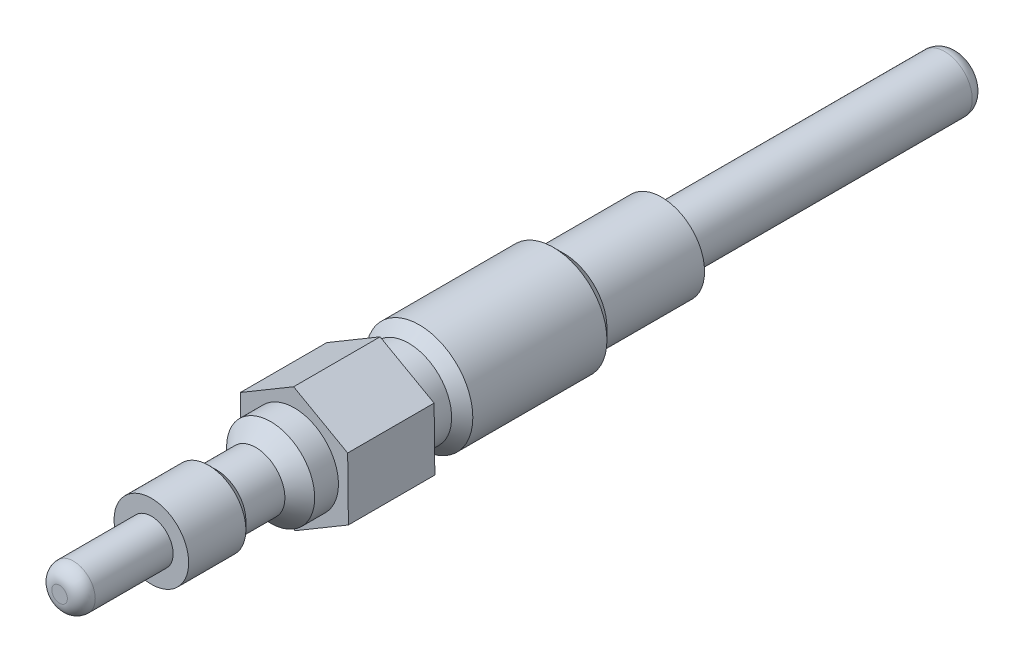
ISO-10303-21;
HEADER;
FILE_DESCRIPTION(('STEP AP214'),'2;1');
FILE_NAME('part.step','',(''),(''),'','','');
FILE_SCHEMA(('AUTOMOTIVE_DESIGN { 1 0 10303 214 1 1 1 1 }'));
ENDSEC;
DATA;
#1=APPLICATION_CONTEXT('core data for automotive mechanical design processes');
#2=APPLICATION_PROTOCOL_DEFINITION('international standard','automotive_design',2000,#1);
#3=PRODUCT_CONTEXT('',#1,'mechanical');
#4=PRODUCT('Part','Part','',(#3));
#5=PRODUCT_RELATED_PRODUCT_CATEGORY('part','',(#4));
#6=PRODUCT_DEFINITION_FORMATION('','',#4);
#7=PRODUCT_DEFINITION_CONTEXT('part definition',#1,'design');
#8=PRODUCT_DEFINITION('design','',#6,#7);
#9=PRODUCT_DEFINITION_SHAPE('','',#8);
#10=(LENGTH_UNIT() NAMED_UNIT(*) SI_UNIT(.MILLI.,.METRE.));
#11=(NAMED_UNIT(*) PLANE_ANGLE_UNIT() SI_UNIT($,.RADIAN.));
#12=(NAMED_UNIT(*) SI_UNIT($,.STERADIAN.) SOLID_ANGLE_UNIT());
#13=UNCERTAINTY_MEASURE_WITH_UNIT(LENGTH_MEASURE(1.E-05),#10,'distance_accuracy_value','');
#14=(GEOMETRIC_REPRESENTATION_CONTEXT(3) GLOBAL_UNCERTAINTY_ASSIGNED_CONTEXT((#13)) GLOBAL_UNIT_ASSIGNED_CONTEXT((#10,
#11,#12)) REPRESENTATION_CONTEXT('',''));
#15=CARTESIAN_POINT('',(0.,0.,0.));
#16=DIRECTION('',(0.,0.,1.));
#17=DIRECTION('',(1.,0.,0.));
#18=AXIS2_PLACEMENT_3D('',#15,#16,#17);
#19=CARTESIAN_POINT('',(0.,0.,-52.6288));
#20=DIRECTION('',(0.,0.,1.));
#21=DIRECTION('',(1.,0.,0.));
#22=AXIS2_PLACEMENT_3D('',#19,#20,#21);
#23=CYLINDRICAL_SURFACE('',#22,4.8768);
#24=CARTESIAN_POINT('',(0.,0.,-15.7226));
#25=DIRECTION('',(0.,0.,1.));
#26=DIRECTION('',(1.,0.,0.));
#27=AXIS2_PLACEMENT_3D('',#24,#25,#26);
#28=CIRCLE('',#27,4.8768);
#29=CARTESIAN_POINT('',(4.8768,0.,-15.7226));
#30=VERTEX_POINT('',#29);
#31=EDGE_CURVE('E170',#30,#30,#28,.T.);
#32=ORIENTED_EDGE('',*,*,#31,.T.);
#33=EDGE_LOOP('',(#32));
#34=FACE_BOUND('',#33,.T.);
#35=CARTESIAN_POINT('',(0.,0.,-3.5052));
#36=DIRECTION('',(0.,0.,-1.));
#37=DIRECTION('',(-1.,0.,0.));
#38=AXIS2_PLACEMENT_3D('',#35,#36,#37);
#39=CIRCLE('',#38,4.8768);
#40=CARTESIAN_POINT('',(-4.8768,0.,-3.5052));
#41=VERTEX_POINT('',#40);
#42=EDGE_CURVE('E139',#41,#41,#39,.T.);
#43=ORIENTED_EDGE('',*,*,#42,.T.);
#44=EDGE_LOOP('',(#43));
#45=FACE_BOUND('',#44,.T.);
#46=ADVANCED_FACE('F43',(#34,#45),#23,.T.);
#47=CARTESIAN_POINT('',(4.9230129308078,-2.76409551507037,7.874));
#48=DIRECTION('',(-0.999928042821284,-0.0119962152196831,0.));
#49=DIRECTION('',(0.0119962152196831,-0.999928042821284,0.));
#50=AXIS2_PLACEMENT_3D('',#47,#48,#49);
#51=PLANE('',#50);
#52=DIRECTION('',(-0.0119962152196831,0.999928042821284,0.));
#53=VECTOR('',#52,1.);
#54=CARTESIAN_POINT('',(4.9230129308078,-2.76409551507037,0.));
#55=LINE('',#54,#53);
#56=CARTESIAN_POINT('',(4.9230129308078,-2.76409551507037,0.));
#57=VERTEX_POINT('',#56);
#58=CARTESIAN_POINT('',(4.85528339994147,2.88140650370365,0.));
#59=VERTEX_POINT('',#58);
#60=EDGE_CURVE('E134',#57,#59,#55,.T.);
#61=ORIENTED_EDGE('',*,*,#60,.T.);
#62=DIRECTION('',(0.,0.,-1.));
#63=VECTOR('',#62,1.);
#64=CARTESIAN_POINT('',(4.85528339994147,2.88140650370365,7.874));
#65=LINE('',#64,#63);
#66=CARTESIAN_POINT('',(4.85528339994147,2.88140650370365,7.874));
#67=VERTEX_POINT('',#66);
#68=EDGE_CURVE('E162',#67,#59,#65,.T.);
#69=ORIENTED_EDGE('',*,*,#68,.F.);
#70=DIRECTION('',(-0.0119962152196831,0.999928042821284,0.));
#71=VECTOR('',#70,1.);
#72=CARTESIAN_POINT('',(4.9230129308078,-2.76409551507037,7.874));
#73=LINE('',#72,#71);
#74=CARTESIAN_POINT('',(4.9230129308078,-2.76409551507037,7.874));
#75=VERTEX_POINT('',#74);
#76=EDGE_CURVE('E151',#75,#67,#73,.T.);
#77=ORIENTED_EDGE('',*,*,#76,.F.);
#78=DIRECTION('',(0.,0.,-1.));
#79=VECTOR('',#78,1.);
#80=CARTESIAN_POINT('',(4.9230129308078,-2.76409551507037,7.874));
#81=LINE('',#80,#79);
#82=EDGE_CURVE('E130',#75,#57,#81,.T.);
#83=ORIENTED_EDGE('',*,*,#82,.T.);
#84=EDGE_LOOP('',(#61,#69,#77,#83));
#85=FACE_BOUND('',#84,.T.);
#86=ADVANCED_FACE('F200',(#85),#51,.F.);
#87=CARTESIAN_POINT('',(4.85528339994147,2.88140650370365,7.874));
#88=DIRECTION('',(-0.489574994281131,-0.871961194649527,0.));
#89=DIRECTION('',(0.871961194649527,-0.489574994281131,0.));
#90=AXIS2_PLACEMENT_3D('',#87,#88,#89);
#91=PLANE('',#90);
#92=DIRECTION('',(-0.871961194649527,0.489574994281131,0.));
#93=VECTOR('',#92,1.);
#94=CARTESIAN_POINT('',(4.85528339994147,2.88140650370365,0.));
#95=LINE('',#94,#93);
#96=CARTESIAN_POINT('',(-0.0677295308663265,5.64550201877403,0.));
#97=VERTEX_POINT('',#96);
#98=EDGE_CURVE('E138',#59,#97,#95,.T.);
#99=ORIENTED_EDGE('',*,*,#98,.T.);
#100=DIRECTION('',(0.,0.,-1.));
#101=VECTOR('',#100,1.);
#102=CARTESIAN_POINT('',(-0.0677295308663265,5.64550201877403,7.874));
#103=LINE('',#102,#101);
#104=CARTESIAN_POINT('',(-0.0677295308663265,5.64550201877403,7.874));
#105=VERTEX_POINT('',#104);
#106=EDGE_CURVE('E158',#105,#97,#103,.T.);
#107=ORIENTED_EDGE('',*,*,#106,.F.);
#108=DIRECTION('',(-0.871961194649527,0.489574994281131,0.));
#109=VECTOR('',#108,1.);
#110=CARTESIAN_POINT('',(4.85528339994147,2.88140650370365,7.874));
#111=LINE('',#110,#109);
#112=EDGE_CURVE('E99',#67,#105,#111,.T.);
#113=ORIENTED_EDGE('',*,*,#112,.F.);
#114=ORIENTED_EDGE('',*,*,#68,.T.);
#115=EDGE_LOOP('',(#99,#107,#113,#114));
#116=FACE_BOUND('',#115,.T.);
#117=ADVANCED_FACE('F206',(#116),#91,.F.);
#118=CARTESIAN_POINT('',(-0.0677295308663265,5.64550201877403,7.874));
#119=DIRECTION('',(0.510353048540153,-0.859964979429844,0.));
#120=DIRECTION('',(0.859964979429844,0.510353048540153,0.));
#121=AXIS2_PLACEMENT_3D('',#118,#119,#120);
#122=PLANE('',#121);
#123=DIRECTION('',(-0.859964979429844,-0.510353048540153,0.));
#124=VECTOR('',#123,1.);
#125=CARTESIAN_POINT('',(-0.0677295308663265,5.64550201877403,0.));
#126=LINE('',#125,#124);
#127=CARTESIAN_POINT('',(-4.92301293080781,2.76409551507037,0.));
#128=VERTEX_POINT('',#127);
#129=EDGE_CURVE('E142',#97,#128,#126,.T.);
#130=ORIENTED_EDGE('',*,*,#129,.T.);
#131=DIRECTION('',(0.,0.,-1.));
#132=VECTOR('',#131,1.);
#133=CARTESIAN_POINT('',(-4.92301293080781,2.76409551507037,7.874));
#134=LINE('',#133,#132);
#135=CARTESIAN_POINT('',(-4.92301293080781,2.76409551507037,7.874));
#136=VERTEX_POINT('',#135);
#137=EDGE_CURVE('E123',#136,#128,#134,.T.);
#138=ORIENTED_EDGE('',*,*,#137,.F.);
#139=DIRECTION('',(-0.859964979429844,-0.510353048540153,0.));
#140=VECTOR('',#139,1.);
#141=CARTESIAN_POINT('',(-0.0677295308663265,5.64550201877403,7.874));
#142=LINE('',#141,#140);
#143=EDGE_CURVE('E112',#105,#136,#142,.T.);
#144=ORIENTED_EDGE('',*,*,#143,.F.);
#145=ORIENTED_EDGE('',*,*,#106,.T.);
#146=EDGE_LOOP('',(#130,#138,#144,#145));
#147=FACE_BOUND('',#146,.T.);
#148=ADVANCED_FACE('F233',(#147),#122,.F.);
#149=CARTESIAN_POINT('',(-4.92301293080781,2.76409551507037,7.874));
#150=DIRECTION('',(0.999928042821284,0.0119962152196825,0.));
#151=DIRECTION('',(-0.0119962152196825,0.999928042821284,0.));
#152=AXIS2_PLACEMENT_3D('',#149,#150,#151);
#153=PLANE('',#152);
#154=DIRECTION('',(0.0119962152196825,-0.999928042821284,0.));
#155=VECTOR('',#154,1.);
#156=CARTESIAN_POINT('',(-4.92301293080781,2.76409551507037,0.));
#157=LINE('',#156,#155);
#158=CARTESIAN_POINT('',(-4.85528339994149,-2.88140650370365,0.));
#159=VERTEX_POINT('',#158);
#160=EDGE_CURVE('E121',#128,#159,#157,.T.);
#161=ORIENTED_EDGE('',*,*,#160,.T.);
#162=DIRECTION('',(0.,0.,-1.));
#163=VECTOR('',#162,1.);
#164=CARTESIAN_POINT('',(-4.85528339994149,-2.88140650370365,7.874));
#165=LINE('',#164,#163);
#166=CARTESIAN_POINT('',(-4.85528339994149,-2.88140650370365,7.874));
#167=VERTEX_POINT('',#166);
#168=EDGE_CURVE('E118',#167,#159,#165,.T.);
#169=ORIENTED_EDGE('',*,*,#168,.F.);
#170=DIRECTION('',(0.0119962152196825,-0.999928042821284,0.));
#171=VECTOR('',#170,1.);
#172=CARTESIAN_POINT('',(-4.92301293080781,2.76409551507037,7.874));
#173=LINE('',#172,#171);
#174=EDGE_CURVE('E106',#136,#167,#173,.T.);
#175=ORIENTED_EDGE('',*,*,#174,.F.);
#176=ORIENTED_EDGE('',*,*,#137,.T.);
#177=EDGE_LOOP('',(#161,#169,#175,#176));
#178=FACE_BOUND('',#177,.T.);
#179=ADVANCED_FACE('F119',(#178),#153,.F.);
#180=CARTESIAN_POINT('',(-4.85528339994149,-2.88140650370365,7.874));
#181=DIRECTION('',(0.489574994281132,0.871961194649527,0.));
#182=DIRECTION('',(-0.871961194649527,0.489574994281132,0.));
#183=AXIS2_PLACEMENT_3D('',#180,#181,#182);
#184=PLANE('',#183);
#185=DIRECTION('',(0.871961194649527,-0.489574994281132,0.));
#186=VECTOR('',#185,1.);
#187=CARTESIAN_POINT('',(-4.85528339994149,-2.88140650370365,0.));
#188=LINE('',#187,#186);
#189=CARTESIAN_POINT('',(0.0677295308663152,-5.64550201877403,0.));
#190=VERTEX_POINT('',#189);
#191=EDGE_CURVE('E84',#159,#190,#188,.T.);
#192=ORIENTED_EDGE('',*,*,#191,.T.);
#193=DIRECTION('',(0.,0.,-1.));
#194=VECTOR('',#193,1.);
#195=CARTESIAN_POINT('',(0.0677295308663152,-5.64550201877403,7.874));
#196=LINE('',#195,#194);
#197=CARTESIAN_POINT('',(0.0677295308663152,-5.64550201877403,7.874));
#198=VERTEX_POINT('',#197);
#199=EDGE_CURVE('E124',#198,#190,#196,.T.);
#200=ORIENTED_EDGE('',*,*,#199,.F.);
#201=DIRECTION('',(0.871961194649527,-0.489574994281132,0.));
#202=VECTOR('',#201,1.);
#203=CARTESIAN_POINT('',(-4.85528339994149,-2.88140650370365,7.874));
#204=LINE('',#203,#202);
#205=EDGE_CURVE('E110',#167,#198,#204,.T.);
#206=ORIENTED_EDGE('',*,*,#205,.F.);
#207=ORIENTED_EDGE('',*,*,#168,.T.);
#208=EDGE_LOOP('',(#192,#200,#206,#207));
#209=FACE_BOUND('',#208,.T.);
#210=ADVANCED_FACE('F126',(#209),#184,.F.);
#211=CARTESIAN_POINT('',(0.0677295308663152,-5.64550201877403,7.874));
#212=DIRECTION('',(-0.510353048540153,0.859964979429845,0.));
#213=DIRECTION('',(-0.859964979429844,-0.510353048540153,0.));
#214=AXIS2_PLACEMENT_3D('',#211,#212,#213);
#215=PLANE('',#214);
#216=DIRECTION('',(0.859964979429844,0.510353048540153,0.));
#217=VECTOR('',#216,1.);
#218=CARTESIAN_POINT('',(0.0677295308663152,-5.64550201877403,0.));
#219=LINE('',#218,#217);
#220=EDGE_CURVE('E90',#190,#57,#219,.T.);
#221=ORIENTED_EDGE('',*,*,#220,.T.);
#222=ORIENTED_EDGE('',*,*,#82,.F.);
#223=DIRECTION('',(0.859964979429844,0.510353048540153,0.));
#224=VECTOR('',#223,1.);
#225=CARTESIAN_POINT('',(0.0677295308663152,-5.64550201877403,7.874));
#226=LINE('',#225,#224);
#227=EDGE_CURVE('E61',#198,#75,#226,.T.);
#228=ORIENTED_EDGE('',*,*,#227,.F.);
#229=ORIENTED_EDGE('',*,*,#199,.T.);
#230=EDGE_LOOP('',(#221,#222,#228,#229));
#231=FACE_BOUND('',#230,.T.);
#232=ADVANCED_FACE('F222',(#231),#215,.F.);
#233=CARTESIAN_POINT('',(0.,0.,7.874));
#234=DIRECTION('',(0.,0.,1.));
#235=DIRECTION('',(1.,0.,0.));
#236=AXIS2_PLACEMENT_3D('',#233,#234,#235);
#237=PLANE('',#236);
#238=CARTESIAN_POINT('',(0.,0.,7.874));
#239=DIRECTION('',(0.,0.,1.));
#240=DIRECTION('',(1.,0.,0.));
#241=AXIS2_PLACEMENT_3D('',#238,#239,#240);
#242=CIRCLE('',#241,4.0132);
#243=CARTESIAN_POINT('',(-4.0132,0.,7.874));
#244=VERTEX_POINT('',#243);
#245=EDGE_CURVE('E165',#244,#244,#242,.T.);
#246=ORIENTED_EDGE('',*,*,#245,.F.);
#247=EDGE_LOOP('',(#246));
#248=FACE_BOUND('',#247,.T.);
#249=ORIENTED_EDGE('',*,*,#76,.T.);
#250=ORIENTED_EDGE('',*,*,#112,.T.);
#251=ORIENTED_EDGE('',*,*,#143,.T.);
#252=ORIENTED_EDGE('',*,*,#174,.T.);
#253=ORIENTED_EDGE('',*,*,#205,.T.);
#254=ORIENTED_EDGE('',*,*,#227,.T.);
#255=EDGE_LOOP('',(#249,#250,#251,#252,#253,#254));
#256=FACE_BOUND('',#255,.T.);
#257=ADVANCED_FACE('F108',(#248,#256),#237,.T.);
#258=CARTESIAN_POINT('',(0.,0.,0.));
#259=DIRECTION('',(0.,0.,1.));
#260=DIRECTION('',(1.,0.,0.));
#261=AXIS2_PLACEMENT_3D('',#258,#259,#260);
#262=PLANE('',#261);
#263=ORIENTED_EDGE('',*,*,#60,.F.);
#264=ORIENTED_EDGE('',*,*,#220,.F.);
#265=ORIENTED_EDGE('',*,*,#191,.F.);
#266=ORIENTED_EDGE('',*,*,#160,.F.);
#267=ORIENTED_EDGE('',*,*,#129,.F.);
#268=ORIENTED_EDGE('',*,*,#98,.F.);
#269=EDGE_LOOP('',(#263,#264,#265,#266,#267,#268));
#270=FACE_BOUND('',#269,.T.);
#271=CARTESIAN_POINT('',(0.,0.,0.));
#272=DIRECTION('',(0.,0.,-1.));
#273=DIRECTION('',(-1.,0.,0.));
#274=AXIS2_PLACEMENT_3D('',#271,#272,#273);
#275=CIRCLE('',#274,3.9116);
#276=CARTESIAN_POINT('',(-3.9116,0.,0.));
#277=VERTEX_POINT('',#276);
#278=EDGE_CURVE('E169',#277,#277,#275,.T.);
#279=ORIENTED_EDGE('',*,*,#278,.F.);
#280=EDGE_LOOP('',(#279));
#281=FACE_BOUND('',#280,.T.);
#282=ADVANCED_FACE('F218',(#270,#281),#262,.F.);
#283=CARTESIAN_POINT('',(0.,0.,29.2608));
#284=DIRECTION('',(0.,0.,-1.));
#285=DIRECTION('',(-1.,0.,0.));
#286=AXIS2_PLACEMENT_3D('',#283,#284,#285);
#287=CYLINDRICAL_SURFACE('',#286,4.0132);
#288=CARTESIAN_POINT('',(0.,0.,10.033));
#289=DIRECTION('',(0.,0.,-1.));
#290=DIRECTION('',(-1.,0.,0.));
#291=AXIS2_PLACEMENT_3D('',#288,#289,#290);
#292=CIRCLE('',#291,4.0132);
#293=CARTESIAN_POINT('',(-4.0132,0.,10.033));
#294=VERTEX_POINT('',#293);
#295=EDGE_CURVE('E265',#294,#294,#292,.T.);
#296=CARTESIAN_POINT('',(-4.0132,0.,10.033));
#297=CARTESIAN_POINT('',(-4.0132,0.,10.0105104166667));
#298=CARTESIAN_POINT('',(-4.0132,0.,9.98802083333334));
#299=CARTESIAN_POINT('',(-4.0132,0.,9.94304166666667));
#300=CARTESIAN_POINT('',(-4.0132,0.,9.92055208333334));
#301=CARTESIAN_POINT('',(-4.0132,0.,9.87557291666667));
#302=CARTESIAN_POINT('',(-4.0132,0.,9.85308333333334));
#303=CARTESIAN_POINT('',(-4.0132,0.,9.80810416666667));
#304=CARTESIAN_POINT('',(-4.0132,0.,9.78561458333333));
#305=CARTESIAN_POINT('',(-4.0132,0.,9.74063541666667));
#306=CARTESIAN_POINT('',(-4.0132,0.,9.71814583333334));
#307=CARTESIAN_POINT('',(-4.0132,0.,9.67316666666667));
#308=CARTESIAN_POINT('',(-4.0132,0.,9.65067708333334));
#309=CARTESIAN_POINT('',(-4.0132,0.,9.60569791666667));
#310=CARTESIAN_POINT('',(-4.0132,0.,9.58320833333334));
#311=CARTESIAN_POINT('',(-4.0132,0.,9.53822916666667));
#312=CARTESIAN_POINT('',(-4.0132,0.,9.51573958333334));
#313=CARTESIAN_POINT('',(-4.0132,0.,9.47076041666667));
#314=CARTESIAN_POINT('',(-4.0132,0.,9.44827083333333));
#315=CARTESIAN_POINT('',(-4.0132,0.,9.40329166666667));
#316=CARTESIAN_POINT('',(-4.0132,0.,9.38080208333333));
#317=CARTESIAN_POINT('',(-4.0132,0.,9.33582291666667));
#318=CARTESIAN_POINT('',(-4.0132,0.,9.31333333333333));
#319=CARTESIAN_POINT('',(-4.0132,0.,9.26835416666667));
#320=CARTESIAN_POINT('',(-4.0132,0.,9.24586458333333));
#321=CARTESIAN_POINT('',(-4.0132,0.,9.20088541666667));
#322=CARTESIAN_POINT('',(-4.0132,0.,9.17839583333333));
#323=CARTESIAN_POINT('',(-4.0132,0.,9.13341666666667));
#324=CARTESIAN_POINT('',(-4.0132,0.,9.11092708333334));
#325=CARTESIAN_POINT('',(-4.0132,0.,9.06594791666667));
#326=CARTESIAN_POINT('',(-4.0132,0.,9.04345833333333));
#327=CARTESIAN_POINT('',(-4.0132,0.,8.99847916666667));
#328=CARTESIAN_POINT('',(-4.0132,0.,8.97598958333333));
#329=CARTESIAN_POINT('',(-4.0132,0.,8.93101041666667));
#330=CARTESIAN_POINT('',(-4.0132,0.,8.90852083333333));
#331=CARTESIAN_POINT('',(-4.0132,0.,8.86354166666666));
#332=CARTESIAN_POINT('',(-4.0132,0.,8.84105208333333));
#333=CARTESIAN_POINT('',(-4.0132,0.,8.79607291666666));
#334=CARTESIAN_POINT('',(-4.0132,0.,8.77358333333333));
#335=CARTESIAN_POINT('',(-4.0132,0.,8.72860416666666));
#336=CARTESIAN_POINT('',(-4.0132,0.,8.70611458333333));
#337=CARTESIAN_POINT('',(-4.0132,0.,8.66113541666667));
#338=CARTESIAN_POINT('',(-4.0132,0.,8.63864583333333));
#339=CARTESIAN_POINT('',(-4.0132,0.,8.59366666666667));
#340=CARTESIAN_POINT('',(-4.0132,0.,8.57117708333333));
#341=CARTESIAN_POINT('',(-4.0132,0.,8.52619791666667));
#342=CARTESIAN_POINT('',(-4.0132,0.,8.50370833333333));
#343=CARTESIAN_POINT('',(-4.0132,0.,8.45872916666666));
#344=CARTESIAN_POINT('',(-4.0132,0.,8.43623958333333));
#345=CARTESIAN_POINT('',(-4.0132,0.,8.39126041666666));
#346=CARTESIAN_POINT('',(-4.0132,0.,8.36877083333333));
#347=CARTESIAN_POINT('',(-4.0132,0.,8.32379166666666));
#348=CARTESIAN_POINT('',(-4.0132,0.,8.30130208333333));
#349=CARTESIAN_POINT('',(-4.0132,0.,8.25632291666666));
#350=CARTESIAN_POINT('',(-4.0132,0.,8.23383333333333));
#351=CARTESIAN_POINT('',(-4.0132,0.,8.18885416666666));
#352=CARTESIAN_POINT('',(-4.0132,0.,8.16636458333333));
#353=CARTESIAN_POINT('',(-4.0132,0.,8.12138541666666));
#354=CARTESIAN_POINT('',(-4.0132,0.,8.09889583333333));
#355=CARTESIAN_POINT('',(-4.0132,0.,8.05391666666666));
#356=CARTESIAN_POINT('',(-4.0132,0.,8.03142708333333));
#357=CARTESIAN_POINT('',(-4.0132,0.,7.98644791666666));
#358=CARTESIAN_POINT('',(-4.0132,0.,7.96395833333333));
#359=CARTESIAN_POINT('',(-4.0132,0.,7.91897916666666));
#360=CARTESIAN_POINT('',(-4.0132,0.,7.89648958333333));
#361=CARTESIAN_POINT('',(-4.0132,0.,7.874));
#362=B_SPLINE_CURVE_WITH_KNOTS('',3,(#296,#297,#298,#299,#300,#301,#302,#303,#304,#305,#306,
#307,#308,#309,#310,#311,#312,#313,#314,#315,#316,#317,#318,#319,#320,#321,#322,#323,#324,#325,
#326,#327,#328,#329,#330,#331,#332,#333,#334,#335,#336,#337,#338,#339,#340,#341,#342,#343,#344,
#345,#346,#347,#348,#349,#350,#351,#352,#353,#354,#355,#356,#357,#358,#359,#360,#361),
.UNSPECIFIED.,.F.,.F.,(4,2,2,2,2,2,2,2,2,2,2,2,2,2,2,2,2,2,2,2,2,2,2,2,2,2,2,2,2,2,2,2,4),(0.,
0.0674687500000007,0.134937500000001,0.202406250000002,0.269875000000003,0.33734375,
0.404812500000001,0.472281250000001,0.539750000000002,0.607218750000003,0.674687500000003,
0.742156250000004,0.809625000000001,0.877093750000002,0.944562500000003,1.01203125,1.0795,
1.14696875,1.21443750000001,1.28190625000001,1.34937500000001,1.41684375,1.4843125,
1.55178125000001,1.61925000000001,1.68671875000001,1.75418750000001,1.82165625000001,
1.88912500000001,1.95659375000001,2.02406250000001,2.09153125000001,2.15900000000001),.UNSPECIFIED.);
#363=EDGE_CURVE('BSEAM214',#294,#244,#362,.T.);
#364=ORIENTED_EDGE('',*,*,#295,.T.);
#365=ORIENTED_EDGE('',*,*,#245,.T.);
#366=ORIENTED_EDGE('',*,*,#363,.T.);
#367=ORIENTED_EDGE('',*,*,#363,.F.);
#368=EDGE_LOOP('',(#364,#366,#365,#367));
#369=FACE_BOUND('',#368,.T.);
#370=ADVANCED_FACE('F214',(#369),#287,.T.);
#371=CARTESIAN_POINT('',(0.,0.,-2.54));
#372=DIRECTION('',(0.,0.,-1.));
#373=DIRECTION('',(-1.,0.,0.));
#374=AXIS2_PLACEMENT_3D('',#371,#372,#373);
#375=CONICAL_SURFACE('',#374,3.9116,0.785398163397451);
#376=CARTESIAN_POINT('',(0.,0.,-2.54));
#377=DIRECTION('',(0.,0.,-1.));
#378=DIRECTION('',(-1.,0.,0.));
#379=AXIS2_PLACEMENT_3D('',#376,#377,#378);
#380=CIRCLE('',#379,3.9116);
#381=CARTESIAN_POINT('',(-3.9116,0.,-2.54));
#382=VERTEX_POINT('',#381);
#383=EDGE_CURVE('E174',#382,#382,#380,.T.);
#384=ORIENTED_EDGE('',*,*,#383,.T.);
#385=EDGE_LOOP('',(#384));
#386=FACE_BOUND('',#385,.T.);
#387=ORIENTED_EDGE('',*,*,#42,.F.);
#388=EDGE_LOOP('',(#387));
#389=FACE_BOUND('',#388,.T.);
#390=ADVANCED_FACE('F217',(#386,#389),#375,.T.);
#391=CARTESIAN_POINT('',(0.,0.,-56.72328));
#392=DIRECTION('',(0.,0.,-1.));
#393=DIRECTION('',(-1.,0.,0.));
#394=AXIS2_PLACEMENT_3D('',#391,#392,#393);
#395=CYLINDRICAL_SURFACE('',#394,3.9116);
#396=ORIENTED_EDGE('',*,*,#383,.F.);
#397=EDGE_LOOP('',(#396));
#398=FACE_BOUND('',#397,.T.);
#399=ORIENTED_EDGE('',*,*,#278,.T.);
#400=EDGE_LOOP('',(#399));
#401=FACE_BOUND('',#400,.T.);
#402=ADVANCED_FACE('F299',(#398,#401),#395,.T.);
#403=CARTESIAN_POINT('',(0.,0.,-14.8707437554731));
#404=DIRECTION('',(0.,0.,1.));
#405=DIRECTION('',(1.,0.,0.));
#406=AXIS2_PLACEMENT_3D('',#403,#404,#405);
#407=CONICAL_SURFACE('',#406,5.72865624452693,0.785398163397451);
#408=CARTESIAN_POINT('',(0.,0.,-16.6878));
#409=DIRECTION('',(0.,0.,-1.));
#410=DIRECTION('',(-1.,0.,0.));
#411=AXIS2_PLACEMENT_3D('',#408,#409,#410);
#412=CIRCLE('',#411,3.9116);
#413=CARTESIAN_POINT('',(-3.9116,0.,-16.6878));
#414=VERTEX_POINT('',#413);
#415=EDGE_CURVE('E175',#414,#414,#412,.T.);
#416=ORIENTED_EDGE('',*,*,#415,.F.);
#417=EDGE_LOOP('',(#416));
#418=FACE_BOUND('',#417,.T.);
#419=ORIENTED_EDGE('',*,*,#31,.F.);
#420=EDGE_LOOP('',(#419));
#421=FACE_BOUND('',#420,.T.);
#422=ADVANCED_FACE('F301',(#418,#421),#407,.T.);
#423=CARTESIAN_POINT('',(0.,0.,-56.72328));
#424=DIRECTION('',(0.,0.,-1.));
#425=DIRECTION('',(-1.,0.,0.));
#426=AXIS2_PLACEMENT_3D('',#423,#424,#425);
#427=CYLINDRICAL_SURFACE('',#426,3.9116);
#428=CARTESIAN_POINT('',(0.,0.,-25.5778));
#429=DIRECTION('',(0.,0.,1.));
#430=DIRECTION('',(1.,0.,0.));
#431=AXIS2_PLACEMENT_3D('',#428,#429,#430);
#432=CIRCLE('',#431,3.9116);
#433=CARTESIAN_POINT('',(3.9116,0.,-25.5778));
#434=VERTEX_POINT('',#433);
#435=EDGE_CURVE('E264',#434,#434,#432,.T.);
#436=ORIENTED_EDGE('',*,*,#435,.T.);
#437=EDGE_LOOP('',(#436));
#438=FACE_BOUND('',#437,.T.);
#439=ORIENTED_EDGE('',*,*,#415,.T.);
#440=EDGE_LOOP('',(#439));
#441=FACE_BOUND('',#440,.T.);
#442=ADVANCED_FACE('F307',(#438,#441),#427,.T.);
#443=CARTESIAN_POINT('',(0.,2.5146,-25.5778));
#444=DIRECTION('',(0.,0.,1.));
#445=DIRECTION('',(1.,0.,0.));
#446=AXIS2_PLACEMENT_3D('',#443,#444,#445);
#447=PLANE('',#446);
#448=CARTESIAN_POINT('',(0.,0.,-25.5778));
#449=DIRECTION('',(0.,0.,-1.));
#450=DIRECTION('',(-1.,0.,0.));
#451=AXIS2_PLACEMENT_3D('',#448,#449,#450);
#452=CIRCLE('',#451,2.5146);
#453=CARTESIAN_POINT('',(-2.5146,0.,-25.5778));
#454=VERTEX_POINT('',#453);
#455=EDGE_CURVE('E261',#454,#454,#452,.T.);
#456=ORIENTED_EDGE('',*,*,#455,.F.);
#457=EDGE_LOOP('',(#456));
#458=FACE_BOUND('',#457,.T.);
#459=ORIENTED_EDGE('',*,*,#435,.F.);
#460=EDGE_LOOP('',(#459));
#461=FACE_BOUND('',#460,.T.);
#462=ADVANCED_FACE('F257',(#458,#461),#447,.F.);
#463=CARTESIAN_POINT('',(0.,0.,-56.72328));
#464=DIRECTION('',(0.,0.,-1.));
#465=DIRECTION('',(-1.,0.,0.));
#466=AXIS2_PLACEMENT_3D('',#463,#464,#465);
#467=CYLINDRICAL_SURFACE('',#466,2.5146);
#468=CARTESIAN_POINT('',(0.,0.,-51.3588));
#469=DIRECTION('',(0.,0.,-1.));
#470=DIRECTION('',(-1.,0.,0.));
#471=AXIS2_PLACEMENT_3D('',#468,#469,#470);
#472=CIRCLE('',#471,2.5146);
#473=CARTESIAN_POINT('',(-2.5146,0.,-51.3588));
#474=VERTEX_POINT('',#473);
#475=EDGE_CURVE('E176',#474,#474,#472,.F.);
#476=ORIENTED_EDGE('',*,*,#475,.T.);
#477=EDGE_LOOP('',(#476));
#478=FACE_BOUND('',#477,.T.);
#479=ORIENTED_EDGE('',*,*,#455,.T.);
#480=EDGE_LOOP('',(#479));
#481=FACE_BOUND('',#480,.T.);
#482=ADVANCED_FACE('F249',(#478,#481),#467,.T.);
#483=CARTESIAN_POINT('',(0.,0.,-52.6288));
#484=DIRECTION('',(0.,0.,-1.));
#485=DIRECTION('',(-1.,0.,0.));
#486=AXIS2_PLACEMENT_3D('',#483,#484,#485);
#487=PLANE('',#486);
#488=CARTESIAN_POINT('',(0.,0.,-52.6288));
#489=DIRECTION('',(0.,0.,-1.));
#490=DIRECTION('',(-1.,0.,0.));
#491=AXIS2_PLACEMENT_3D('',#488,#489,#490);
#492=CIRCLE('',#491,1.2446);
#493=CARTESIAN_POINT('',(-1.2446,0.,-52.6288));
#494=VERTEX_POINT('',#493);
#495=EDGE_CURVE('E180',#494,#494,#492,.T.);
#496=ORIENTED_EDGE('',*,*,#495,.T.);
#497=EDGE_LOOP('',(#496));
#498=FACE_BOUND('',#497,.T.);
#499=ADVANCED_FACE('F211',(#498),#487,.T.);
#500=CARTESIAN_POINT('',(0.,0.,-51.3588));
#501=DIRECTION('',(0.,0.,-1.));
#502=DIRECTION('',(-1.,0.,0.));
#503=AXIS2_PLACEMENT_3D('',#500,#501,#502);
#504=DEGENERATE_TOROIDAL_SURFACE('',#503,1.2446,1.27,.T.);
#505=ORIENTED_EDGE('',*,*,#495,.F.);
#506=EDGE_LOOP('',(#505));
#507=FACE_BOUND('',#506,.T.);
#508=ORIENTED_EDGE('',*,*,#475,.F.);
#509=EDGE_LOOP('',(#508));
#510=FACE_BOUND('',#509,.T.);
#511=ADVANCED_FACE('F238',(#507,#510),#504,.T.);
#512=CARTESIAN_POINT('',(0.,0.,11.3919));
#513=DIRECTION('',(0.,0.,-1.));
#514=DIRECTION('',(-1.,0.,0.));
#515=AXIS2_PLACEMENT_3D('',#512,#513,#514);
#516=CONICAL_SURFACE('',#515,2.6543,0.78539816339745);
#517=ORIENTED_EDGE('',*,*,#295,.F.);
#518=EDGE_LOOP('',(#517));
#519=FACE_BOUND('',#518,.T.);
#520=CARTESIAN_POINT('',(0.,0.,11.3919));
#521=DIRECTION('',(0.,0.,-1.));
#522=DIRECTION('',(-1.,0.,0.));
#523=AXIS2_PLACEMENT_3D('',#520,#521,#522);
#524=CIRCLE('',#523,2.6543);
#525=CARTESIAN_POINT('',(-2.6543,0.,11.3919));
#526=VERTEX_POINT('',#525);
#527=EDGE_CURVE('E272',#526,#526,#524,.T.);
#528=ORIENTED_EDGE('',*,*,#527,.T.);
#529=EDGE_LOOP('',(#528));
#530=FACE_BOUND('',#529,.T.);
#531=ADVANCED_FACE('F240',(#519,#530),#516,.T.);
#532=CARTESIAN_POINT('',(0.,0.,-56.72328));
#533=DIRECTION('',(0.,0.,-1.));
#534=DIRECTION('',(-1.,0.,0.));
#535=AXIS2_PLACEMENT_3D('',#532,#533,#534);
#536=CYLINDRICAL_SURFACE('',#535,2.6543);
#537=ORIENTED_EDGE('',*,*,#527,.F.);
#538=EDGE_LOOP('',(#537));
#539=FACE_BOUND('',#538,.T.);
#540=CARTESIAN_POINT('',(0.,0.,14.9479));
#541=DIRECTION('',(0.,0.,-1.));
#542=DIRECTION('',(-1.,0.,0.));
#543=AXIS2_PLACEMENT_3D('',#540,#541,#542);
#544=CIRCLE('',#543,2.6543);
#545=CARTESIAN_POINT('',(-2.6543,0.,14.9479));
#546=VERTEX_POINT('',#545);
#547=EDGE_CURVE('E554',#546,#546,#544,.T.);
#548=ORIENTED_EDGE('',*,*,#547,.T.);
#549=EDGE_LOOP('',(#548));
#550=FACE_BOUND('',#549,.T.);
#551=ADVANCED_FACE('F246',(#539,#550),#536,.T.);
#552=CARTESIAN_POINT('',(0.,0.,15.6917436465399));
#553=DIRECTION('',(0.,0.,1.));
#554=DIRECTION('',(1.,0.,0.));
#555=AXIS2_PLACEMENT_3D('',#552,#553,#554);
#556=CONICAL_SURFACE('',#555,3.3981436465399,0.785398163397458);
#557=ORIENTED_EDGE('',*,*,#547,.F.);
#558=EDGE_LOOP('',(#557));
#559=FACE_BOUND('',#558,.T.);
#560=CARTESIAN_POINT('',(0.,0.,15.6917436465399));
#561=DIRECTION('',(0.,0.,-1.));
#562=DIRECTION('',(-1.,0.,0.));
#563=AXIS2_PLACEMENT_3D('',#560,#561,#562);
#564=CIRCLE('',#563,3.3981436465399);
#565=CARTESIAN_POINT('',(-3.3981436465399,0.,15.6917436465399));
#566=VERTEX_POINT('',#565);
#567=EDGE_CURVE('E548',#566,#566,#564,.T.);
#568=ORIENTED_EDGE('',*,*,#567,.T.);
#569=EDGE_LOOP('',(#568));
#570=FACE_BOUND('',#569,.T.);
#571=ADVANCED_FACE('F321',(#559,#570),#556,.T.);
#572=CARTESIAN_POINT('',(0.,0.,-56.72328));
#573=DIRECTION('',(0.,0.,-1.));
#574=DIRECTION('',(-1.,0.,0.));
#575=AXIS2_PLACEMENT_3D('',#572,#573,#574);
#576=CYLINDRICAL_SURFACE('',#575,3.3981436465399);
#577=ORIENTED_EDGE('',*,*,#567,.F.);
#578=EDGE_LOOP('',(#577));
#579=FACE_BOUND('',#578,.T.);
#580=CARTESIAN_POINT('',(0.,0.,20.8987436465399));
#581=DIRECTION('',(0.,0.,-1.));
#582=DIRECTION('',(-1.,0.,0.));
#583=AXIS2_PLACEMENT_3D('',#580,#581,#582);
#584=CIRCLE('',#583,3.3981436465399);
#585=CARTESIAN_POINT('',(-3.3981436465399,0.,20.8987436465399));
#586=VERTEX_POINT('',#585);
#587=EDGE_CURVE('E541',#586,#586,#584,.T.);
#588=ORIENTED_EDGE('',*,*,#587,.T.);
#589=EDGE_LOOP('',(#588));
#590=FACE_BOUND('',#589,.T.);
#591=ADVANCED_FACE('F325',(#579,#590),#576,.T.);
#592=CARTESIAN_POINT('',(0.,3.3981436465399,20.8987436465399));
#593=DIRECTION('',(0.,0.,-1.));
#594=DIRECTION('',(-1.,0.,0.));
#595=AXIS2_PLACEMENT_3D('',#592,#593,#594);
#596=PLANE('',#595);
#597=ORIENTED_EDGE('',*,*,#587,.F.);
#598=EDGE_LOOP('',(#597));
#599=FACE_BOUND('',#598,.T.);
#600=CARTESIAN_POINT('',(0.,0.,20.8987436465399));
#601=DIRECTION('',(0.,0.,-1.));
#602=DIRECTION('',(-1.,0.,0.));
#603=AXIS2_PLACEMENT_3D('',#600,#601,#602);
#604=CIRCLE('',#603,1.9812);
#605=CARTESIAN_POINT('',(-1.9812,0.,20.8987436465399));
#606=VERTEX_POINT('',#605);
#607=EDGE_CURVE('E544',#606,#606,#604,.T.);
#608=ORIENTED_EDGE('',*,*,#607,.T.);
#609=EDGE_LOOP('',(#608));
#610=FACE_BOUND('',#609,.T.);
#611=ADVANCED_FACE('F329',(#599,#610),#596,.F.);
#612=CARTESIAN_POINT('',(0.,0.,-56.72328));
#613=DIRECTION('',(0.,0.,-1.));
#614=DIRECTION('',(-1.,0.,0.));
#615=AXIS2_PLACEMENT_3D('',#612,#613,#614);
#616=CYLINDRICAL_SURFACE('',#615,1.9812);
#617=CARTESIAN_POINT('',(0.,0.,27.9908));
#618=DIRECTION('',(0.,0.,1.));
#619=DIRECTION('',(1.,0.,0.));
#620=AXIS2_PLACEMENT_3D('',#617,#618,#619);
#621=CIRCLE('',#620,1.9812);
#622=CARTESIAN_POINT('',(1.9812,0.,27.9908));
#623=VERTEX_POINT('',#622);
#624=EDGE_CURVE('E53',#623,#623,#621,.F.);
#625=ORIENTED_EDGE('',*,*,#624,.T.);
#626=EDGE_LOOP('',(#625));
#627=FACE_BOUND('',#626,.T.);
#628=ORIENTED_EDGE('',*,*,#607,.F.);
#629=EDGE_LOOP('',(#628));
#630=FACE_BOUND('',#629,.T.);
#631=ADVANCED_FACE('F187',(#627,#630),#616,.T.);
#632=CARTESIAN_POINT('',(0.,0.,29.2608));
#633=DIRECTION('',(0.,0.,1.));
#634=DIRECTION('',(1.,0.,0.));
#635=AXIS2_PLACEMENT_3D('',#632,#633,#634);
#636=PLANE('',#635);
#637=CARTESIAN_POINT('',(0.,0.,29.2608));
#638=DIRECTION('',(0.,0.,1.));
#639=DIRECTION('',(1.,0.,0.));
#640=AXIS2_PLACEMENT_3D('',#637,#638,#639);
#641=CIRCLE('',#640,0.711199999999999);
#642=CARTESIAN_POINT('',(0.711199999999999,0.,29.2608));
#643=VERTEX_POINT('',#642);
#644=EDGE_CURVE('E12',#643,#643,#641,.T.);
#645=ORIENTED_EDGE('',*,*,#644,.T.);
#646=EDGE_LOOP('',(#645));
#647=FACE_BOUND('',#646,.T.);
#648=ADVANCED_FACE('F191',(#647),#636,.T.);
#649=CARTESIAN_POINT('',(0.,0.,27.9908));
#650=DIRECTION('',(0.,0.,1.));
#651=DIRECTION('',(1.,0.,0.));
#652=AXIS2_PLACEMENT_3D('',#649,#650,#651);
#653=DEGENERATE_TOROIDAL_SURFACE('',#652,0.711199999999999,1.27,.T.);
#654=ORIENTED_EDGE('',*,*,#644,.F.);
#655=EDGE_LOOP('',(#654));
#656=FACE_BOUND('',#655,.T.);
#657=ORIENTED_EDGE('',*,*,#624,.F.);
#658=EDGE_LOOP('',(#657));
#659=FACE_BOUND('',#658,.T.);
#660=ADVANCED_FACE('F45',(#656,#659),#653,.T.);
#661=CLOSED_SHELL('',(#46,#86,#117,#148,#179,#210,#232,#257,#282,#370,#390,#402,#422,#442,#462,
#482,#499,#511,#531,#551,#571,#591,#611,#631,#648,#660));
#662=MANIFOLD_SOLID_BREP('B2',#661);
#663=ADVANCED_BREP_SHAPE_REPRESENTATION('',(#18,#662),#14);
#664=SHAPE_DEFINITION_REPRESENTATION(#9,#663);
ENDSEC;
END-ISO-10303-21;
